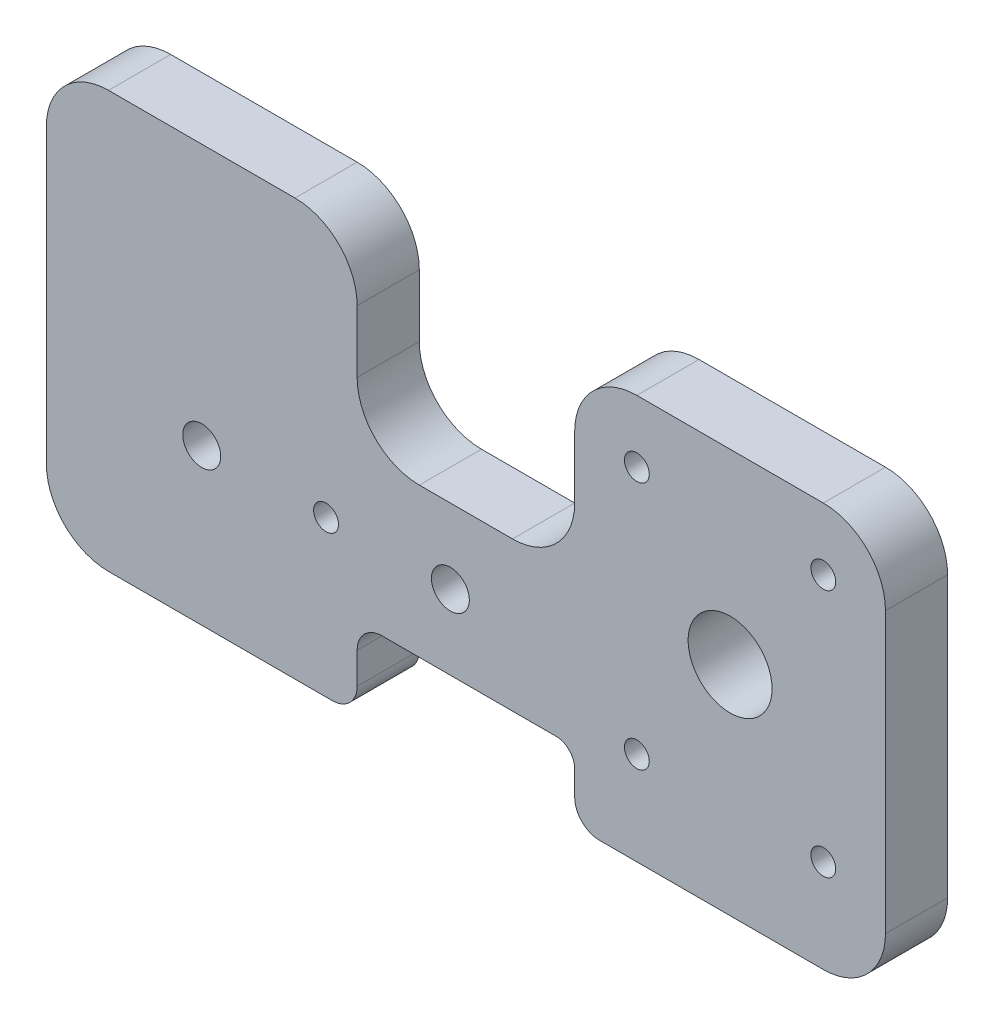
ISO-10303-21;
HEADER;
FILE_DESCRIPTION(('STEP AP214'),'2;1');
FILE_NAME('part.step','',(''),(''),'','','');
FILE_SCHEMA(('AUTOMOTIVE_DESIGN { 1 0 10303 214 1 1 1 1 }'));
ENDSEC;
DATA;
#1=APPLICATION_CONTEXT('core data for automotive mechanical design processes');
#2=APPLICATION_PROTOCOL_DEFINITION('international standard','automotive_design',2000,#1);
#3=PRODUCT_CONTEXT('',#1,'mechanical');
#4=PRODUCT('Part','Part','',(#3));
#5=PRODUCT_RELATED_PRODUCT_CATEGORY('part','',(#4));
#6=PRODUCT_DEFINITION_FORMATION('','',#4);
#7=PRODUCT_DEFINITION_CONTEXT('part definition',#1,'design');
#8=PRODUCT_DEFINITION('design','',#6,#7);
#9=PRODUCT_DEFINITION_SHAPE('','',#8);
#10=(LENGTH_UNIT() NAMED_UNIT(*) SI_UNIT(.MILLI.,.METRE.));
#11=(NAMED_UNIT(*) PLANE_ANGLE_UNIT() SI_UNIT($,.RADIAN.));
#12=(NAMED_UNIT(*) SI_UNIT($,.STERADIAN.) SOLID_ANGLE_UNIT());
#13=UNCERTAINTY_MEASURE_WITH_UNIT(LENGTH_MEASURE(1.E-05),#10,'distance_accuracy_value','');
#14=(GEOMETRIC_REPRESENTATION_CONTEXT(3) GLOBAL_UNCERTAINTY_ASSIGNED_CONTEXT((#13)) GLOBAL_UNIT_ASSIGNED_CONTEXT((#10,
#11,#12)) REPRESENTATION_CONTEXT('',''));
#15=CARTESIAN_POINT('',(0.,0.,0.));
#16=DIRECTION('',(0.,0.,1.));
#17=DIRECTION('',(1.,0.,0.));
#18=AXIS2_PLACEMENT_3D('',#15,#16,#17);
#19=CARTESIAN_POINT('',(110.9105691057,-0.999999999999983,10.));
#20=DIRECTION('',(0.,0.,1.));
#21=DIRECTION('',(1.,0.,0.));
#22=AXIS2_PLACEMENT_3D('',#19,#20,#21);
#23=PLANE('',#22);
#24=CARTESIAN_POINT('',(131.9105691057,30.,10.));
#25=DIRECTION('',(0.,0.,1.));
#26=DIRECTION('',(1.,0.,0.));
#27=AXIS2_PLACEMENT_3D('',#24,#25,#26);
#28=CIRCLE('',#27,6.75000000000001);
#29=CARTESIAN_POINT('',(138.6605691057,30.,10.));
#30=VERTEX_POINT('',#29);
#31=EDGE_CURVE('E465',#30,#30,#28,.T.);
#32=ORIENTED_EDGE('',*,*,#31,.F.);
#33=EDGE_LOOP('',(#32));
#34=FACE_BOUND('',#33,.T.);
#35=CARTESIAN_POINT('',(146.9105691057,50.,10.));
#36=DIRECTION('',(0.,0.,1.));
#37=DIRECTION('',(1.,0.,0.));
#38=AXIS2_PLACEMENT_3D('',#35,#36,#37);
#39=CIRCLE('',#38,1.99999999999997);
#40=CARTESIAN_POINT('',(148.9105691057,50.,10.));
#41=VERTEX_POINT('',#40);
#42=EDGE_CURVE('E477',#41,#41,#39,.T.);
#43=ORIENTED_EDGE('',*,*,#42,.F.);
#44=EDGE_LOOP('',(#43));
#45=FACE_BOUND('',#44,.T.);
#46=CARTESIAN_POINT('',(116.9105691057,10.,10.));
#47=DIRECTION('',(0.,0.,1.));
#48=DIRECTION('',(1.,0.,0.));
#49=AXIS2_PLACEMENT_3D('',#46,#47,#48);
#50=CIRCLE('',#49,2.00000000000002);
#51=CARTESIAN_POINT('',(118.9105691057,10.,10.));
#52=VERTEX_POINT('',#51);
#53=EDGE_CURVE('E489',#52,#52,#50,.T.);
#54=ORIENTED_EDGE('',*,*,#53,.F.);
#55=EDGE_LOOP('',(#54));
#56=FACE_BOUND('',#55,.T.);
#57=CARTESIAN_POINT('',(66.9105691057,18.,10.));
#58=DIRECTION('',(0.,0.,1.));
#59=DIRECTION('',(1.,0.,0.));
#60=AXIS2_PLACEMENT_3D('',#57,#58,#59);
#61=CIRCLE('',#60,1.99999999999999);
#62=CARTESIAN_POINT('',(68.9105691057,18.,10.));
#63=VERTEX_POINT('',#62);
#64=EDGE_CURVE('E232',#63,#63,#61,.T.);
#65=ORIENTED_EDGE('',*,*,#64,.F.);
#66=EDGE_LOOP('',(#65));
#67=FACE_BOUND('',#66,.T.);
#68=CARTESIAN_POINT('',(110.9105691057,-0.999999999999983,10.));
#69=DIRECTION('',(0.,0.,1.));
#70=DIRECTION('',(1.,0.,0.));
#71=AXIS2_PLACEMENT_3D('',#68,#69,#70);
#72=CIRCLE('',#71,4.00000000000002);
#73=CARTESIAN_POINT('',(106.9105691057,-1.,10.));
#74=VERTEX_POINT('',#73);
#75=CARTESIAN_POINT('',(110.9105691057,-5.,10.));
#76=VERTEX_POINT('',#75);
#77=EDGE_CURVE('E275',#74,#76,#72,.T.);
#78=ORIENTED_EDGE('',*,*,#77,.T.);
#79=DIRECTION('',(1.,0.,0.));
#80=VECTOR('',#79,1.);
#81=CARTESIAN_POINT('',(146.9105691057,-5.,10.));
#82=LINE('',#81,#80);
#83=CARTESIAN_POINT('',(146.9105691057,-5.,10.));
#84=VERTEX_POINT('',#83);
#85=EDGE_CURVE('E143',#76,#84,#82,.T.);
#86=ORIENTED_EDGE('',*,*,#85,.T.);
#87=CARTESIAN_POINT('',(146.9105691057,5.00000000000001,10.));
#88=DIRECTION('',(0.,0.,1.));
#89=DIRECTION('',(1.,0.,0.));
#90=AXIS2_PLACEMENT_3D('',#87,#88,#89);
#91=CIRCLE('',#90,10.);
#92=CARTESIAN_POINT('',(156.9105691057,5.,10.));
#93=VERTEX_POINT('',#92);
#94=EDGE_CURVE('E338',#84,#93,#91,.T.);
#95=ORIENTED_EDGE('',*,*,#94,.T.);
#96=DIRECTION('',(0.,1.,0.));
#97=VECTOR('',#96,1.);
#98=CARTESIAN_POINT('',(156.9105691057,5.,10.));
#99=LINE('',#98,#97);
#100=CARTESIAN_POINT('',(156.9105691057,50.,10.));
#101=VERTEX_POINT('',#100);
#102=EDGE_CURVE('E357',#93,#101,#99,.T.);
#103=ORIENTED_EDGE('',*,*,#102,.T.);
#104=CARTESIAN_POINT('',(146.9105691057,50.,10.));
#105=DIRECTION('',(0.,0.,1.));
#106=DIRECTION('',(1.,0.,0.));
#107=AXIS2_PLACEMENT_3D('',#104,#105,#106);
#108=CIRCLE('',#107,10.);
#109=CARTESIAN_POINT('',(146.9105691057,60.,10.));
#110=VERTEX_POINT('',#109);
#111=EDGE_CURVE('E354',#101,#110,#108,.T.);
#112=ORIENTED_EDGE('',*,*,#111,.T.);
#113=DIRECTION('',(-1.,0.,0.));
#114=VECTOR('',#113,1.);
#115=CARTESIAN_POINT('',(146.9105691057,60.,10.));
#116=LINE('',#115,#114);
#117=CARTESIAN_POINT('',(116.9105691057,60.,10.));
#118=VERTEX_POINT('',#117);
#119=EDGE_CURVE('E356',#110,#118,#116,.T.);
#120=ORIENTED_EDGE('',*,*,#119,.T.);
#121=CARTESIAN_POINT('',(116.9105691057,50.,10.));
#122=DIRECTION('',(0.,0.,1.));
#123=DIRECTION('',(1.,0.,0.));
#124=AXIS2_PLACEMENT_3D('',#121,#122,#123);
#125=CIRCLE('',#124,10.);
#126=CARTESIAN_POINT('',(106.9105691057,50.,10.));
#127=VERTEX_POINT('',#126);
#128=EDGE_CURVE('E359',#118,#127,#125,.T.);
#129=ORIENTED_EDGE('',*,*,#128,.T.);
#130=DIRECTION('',(0.,-1.,0.));
#131=VECTOR('',#130,1.);
#132=CARTESIAN_POINT('',(106.9105691057,50.,10.));
#133=LINE('',#132,#131);
#134=CARTESIAN_POINT('',(106.9105691057,40.0000000000001,10.));
#135=VERTEX_POINT('',#134);
#136=EDGE_CURVE('E365',#127,#135,#133,.T.);
#137=ORIENTED_EDGE('',*,*,#136,.T.);
#138=CARTESIAN_POINT('',(96.9105691056999,40.0000000000001,10.));
#139=DIRECTION('',(0.,0.,-1.));
#140=DIRECTION('',(1.,0.,0.));
#141=AXIS2_PLACEMENT_3D('',#138,#139,#140);
#142=CIRCLE('',#141,10.0000000000001);
#143=CARTESIAN_POINT('',(96.9105691057,30.,10.));
#144=VERTEX_POINT('',#143);
#145=EDGE_CURVE('E367',#135,#144,#142,.T.);
#146=ORIENTED_EDGE('',*,*,#145,.T.);
#147=DIRECTION('',(-1.,0.,0.));
#148=VECTOR('',#147,1.);
#149=CARTESIAN_POINT('',(96.9105691057,30.,10.));
#150=LINE('',#149,#148);
#151=CARTESIAN_POINT('',(81.9105691057,30.,10.));
#152=VERTEX_POINT('',#151);
#153=EDGE_CURVE('E369',#144,#152,#150,.T.);
#154=ORIENTED_EDGE('',*,*,#153,.T.);
#155=CARTESIAN_POINT('',(81.9105691057,40.,10.));
#156=DIRECTION('',(0.,0.,-1.));
#157=DIRECTION('',(1.,0.,0.));
#158=AXIS2_PLACEMENT_3D('',#155,#156,#157);
#159=CIRCLE('',#158,10.);
#160=CARTESIAN_POINT('',(71.9105691057,40.,10.));
#161=VERTEX_POINT('',#160);
#162=EDGE_CURVE('E371',#152,#161,#159,.T.);
#163=ORIENTED_EDGE('',*,*,#162,.T.);
#164=DIRECTION('',(0.,1.,0.));
#165=VECTOR('',#164,1.);
#166=CARTESIAN_POINT('',(71.9105691057,50.,10.));
#167=LINE('',#166,#165);
#168=CARTESIAN_POINT('',(71.9105691057,50.,10.));
#169=VERTEX_POINT('',#168);
#170=EDGE_CURVE('E373',#161,#169,#167,.T.);
#171=ORIENTED_EDGE('',*,*,#170,.T.);
#172=CARTESIAN_POINT('',(61.9105691057,50.,10.));
#173=DIRECTION('',(0.,0.,1.));
#174=DIRECTION('',(1.,0.,0.));
#175=AXIS2_PLACEMENT_3D('',#172,#173,#174);
#176=CIRCLE('',#175,10.);
#177=CARTESIAN_POINT('',(61.9105691057,60.,10.));
#178=VERTEX_POINT('',#177);
#179=EDGE_CURVE('E375',#169,#178,#176,.T.);
#180=ORIENTED_EDGE('',*,*,#179,.T.);
#181=DIRECTION('',(-1.,0.,0.));
#182=VECTOR('',#181,1.);
#183=CARTESIAN_POINT('',(31.9105691057,60.,10.));
#184=LINE('',#183,#182);
#185=CARTESIAN_POINT('',(31.9105691057,60.,10.));
#186=VERTEX_POINT('',#185);
#187=EDGE_CURVE('E377',#178,#186,#184,.T.);
#188=ORIENTED_EDGE('',*,*,#187,.T.);
#189=CARTESIAN_POINT('',(31.9105691057,50.,10.));
#190=DIRECTION('',(0.,0.,1.));
#191=DIRECTION('',(1.,0.,0.));
#192=AXIS2_PLACEMENT_3D('',#189,#190,#191);
#193=CIRCLE('',#192,10.);
#194=CARTESIAN_POINT('',(21.9105691057,50.,10.));
#195=VERTEX_POINT('',#194);
#196=EDGE_CURVE('E379',#186,#195,#193,.T.);
#197=ORIENTED_EDGE('',*,*,#196,.T.);
#198=DIRECTION('',(0.,-1.,0.));
#199=VECTOR('',#198,1.);
#200=CARTESIAN_POINT('',(21.9105691057,2.9650844795,10.));
#201=LINE('',#200,#199);
#202=CARTESIAN_POINT('',(21.9105691057,2.9650844795,10.));
#203=VERTEX_POINT('',#202);
#204=EDGE_CURVE('E381',#195,#203,#201,.T.);
#205=ORIENTED_EDGE('',*,*,#204,.T.);
#206=CARTESIAN_POINT('',(31.9105691057,2.96508447950001,10.));
#207=DIRECTION('',(0.,0.,1.));
#208=DIRECTION('',(1.,0.,0.));
#209=AXIS2_PLACEMENT_3D('',#206,#207,#208);
#210=CIRCLE('',#209,10.);
#211=CARTESIAN_POINT('',(31.9105691057,-7.0349155205,10.));
#212=VERTEX_POINT('',#211);
#213=EDGE_CURVE('E383',#203,#212,#210,.T.);
#214=ORIENTED_EDGE('',*,*,#213,.T.);
#215=DIRECTION('',(1.,0.,0.));
#216=VECTOR('',#215,1.);
#217=CARTESIAN_POINT('',(67.9105691057,-7.0349155205,10.));
#218=LINE('',#217,#216);
#219=CARTESIAN_POINT('',(67.9105691057,-7.0349155205,10.));
#220=VERTEX_POINT('',#219);
#221=EDGE_CURVE('E385',#212,#220,#218,.T.);
#222=ORIENTED_EDGE('',*,*,#221,.T.);
#223=CARTESIAN_POINT('',(67.9105691057,-3.0349155205,10.));
#224=DIRECTION('',(0.,0.,1.));
#225=DIRECTION('',(1.,0.,0.));
#226=AXIS2_PLACEMENT_3D('',#223,#224,#225);
#227=CIRCLE('',#226,4.);
#228=CARTESIAN_POINT('',(71.9105691057,-3.0349155205,10.));
#229=VERTEX_POINT('',#228);
#230=EDGE_CURVE('E387',#220,#229,#227,.T.);
#231=ORIENTED_EDGE('',*,*,#230,.T.);
#232=DIRECTION('',(0.,1.,0.));
#233=VECTOR('',#232,1.);
#234=CARTESIAN_POINT('',(71.9105691057,2.,10.));
#235=LINE('',#234,#233);
#236=CARTESIAN_POINT('',(71.9105691057,2.,10.));
#237=VERTEX_POINT('',#236);
#238=EDGE_CURVE('E389',#229,#237,#235,.T.);
#239=ORIENTED_EDGE('',*,*,#238,.T.);
#240=CARTESIAN_POINT('',(75.9105691057,2.,10.));
#241=DIRECTION('',(0.,0.,-1.));
#242=DIRECTION('',(1.,0.,0.));
#243=AXIS2_PLACEMENT_3D('',#240,#241,#242);
#244=CIRCLE('',#243,4.00000000000001);
#245=CARTESIAN_POINT('',(75.9105691057,6.,10.));
#246=VERTEX_POINT('',#245);
#247=EDGE_CURVE('E210',#237,#246,#244,.T.);
#248=ORIENTED_EDGE('',*,*,#247,.T.);
#249=DIRECTION('',(1.,0.,0.));
#250=VECTOR('',#249,1.);
#251=CARTESIAN_POINT('',(75.9105691057,6.,10.));
#252=LINE('',#251,#250);
#253=CARTESIAN_POINT('',(103.9105691057,5.99999999999999,10.));
#254=VERTEX_POINT('',#253);
#255=EDGE_CURVE('E204',#246,#254,#252,.T.);
#256=ORIENTED_EDGE('',*,*,#255,.T.);
#257=CARTESIAN_POINT('',(103.9105691057,2.99999999999994,10.));
#258=DIRECTION('',(0.,0.,-1.));
#259=DIRECTION('',(1.,0.,0.));
#260=AXIS2_PLACEMENT_3D('',#257,#258,#259);
#261=CIRCLE('',#260,3.00000000000005);
#262=CARTESIAN_POINT('',(106.9105691057,3.,10.));
#263=VERTEX_POINT('',#262);
#264=EDGE_CURVE('E208',#254,#263,#261,.T.);
#265=ORIENTED_EDGE('',*,*,#264,.T.);
#266=DIRECTION('',(0.,-1.,0.));
#267=VECTOR('',#266,1.);
#268=CARTESIAN_POINT('',(106.9105691057,-1.,10.));
#269=LINE('',#268,#267);
#270=EDGE_CURVE('E52',#263,#74,#269,.T.);
#271=ORIENTED_EDGE('',*,*,#270,.T.);
#272=EDGE_LOOP('',(#78,#86,#95,#103,#112,#120,#129,#137,#146,#154,#163,#171,#180,#188,#197,#205,
#214,#222,#231,#239,#248,#256,#265,#271));
#273=FACE_BOUND('',#272,.T.);
#274=CARTESIAN_POINT('',(46.9105691057,18.,10.));
#275=DIRECTION('',(0.,0.,1.));
#276=DIRECTION('',(1.,0.,0.));
#277=AXIS2_PLACEMENT_3D('',#274,#275,#276);
#278=CIRCLE('',#277,3.05);
#279=CARTESIAN_POINT('',(49.9605691057,18.,10.));
#280=VERTEX_POINT('',#279);
#281=EDGE_CURVE('E495',#280,#280,#278,.T.);
#282=ORIENTED_EDGE('',*,*,#281,.F.);
#283=EDGE_LOOP('',(#282));
#284=FACE_BOUND('',#283,.T.);
#285=CARTESIAN_POINT('',(146.9105691057,10.,10.));
#286=DIRECTION('',(0.,0.,1.));
#287=DIRECTION('',(1.,0.,0.));
#288=AXIS2_PLACEMENT_3D('',#285,#286,#287);
#289=CIRCLE('',#288,1.99999999999997);
#290=CARTESIAN_POINT('',(148.9105691057,10.,10.));
#291=VERTEX_POINT('',#290);
#292=EDGE_CURVE('E483',#291,#291,#289,.T.);
#293=ORIENTED_EDGE('',*,*,#292,.F.);
#294=EDGE_LOOP('',(#293));
#295=FACE_BOUND('',#294,.T.);
#296=CARTESIAN_POINT('',(116.9105691057,50.,10.));
#297=DIRECTION('',(0.,0.,1.));
#298=DIRECTION('',(1.,0.,0.));
#299=AXIS2_PLACEMENT_3D('',#296,#297,#298);
#300=CIRCLE('',#299,2.00000000000002);
#301=CARTESIAN_POINT('',(118.9105691057,50.,10.));
#302=VERTEX_POINT('',#301);
#303=EDGE_CURVE('E471',#302,#302,#300,.T.);
#304=ORIENTED_EDGE('',*,*,#303,.F.);
#305=EDGE_LOOP('',(#304));
#306=FACE_BOUND('',#305,.T.);
#307=CARTESIAN_POINT('',(86.9105691057,18.,10.));
#308=DIRECTION('',(0.,0.,1.));
#309=DIRECTION('',(1.,0.,0.));
#310=AXIS2_PLACEMENT_3D('',#307,#308,#309);
#311=CIRCLE('',#310,3.05);
#312=CARTESIAN_POINT('',(89.9605691057,18.,10.));
#313=VERTEX_POINT('',#312);
#314=EDGE_CURVE('E456',#313,#313,#311,.T.);
#315=ORIENTED_EDGE('',*,*,#314,.F.);
#316=EDGE_LOOP('',(#315));
#317=FACE_BOUND('',#316,.T.);
#318=ADVANCED_FACE('F35',(#34,#45,#56,#67,#273,#284,#295,#306,#317),#23,.T.);
#319=CARTESIAN_POINT('',(110.9105691057,-0.999999999999983,0.));
#320=DIRECTION('',(0.,0.,1.));
#321=DIRECTION('',(1.,0.,0.));
#322=AXIS2_PLACEMENT_3D('',#319,#320,#321);
#323=PLANE('',#322);
#324=CARTESIAN_POINT('',(110.9105691057,-0.999999999999983,0.));
#325=DIRECTION('',(0.,0.,1.));
#326=DIRECTION('',(1.,0.,0.));
#327=AXIS2_PLACEMENT_3D('',#324,#325,#326);
#328=CIRCLE('',#327,4.00000000000002);
#329=CARTESIAN_POINT('',(106.9105691057,-1.,0.));
#330=VERTEX_POINT('',#329);
#331=CARTESIAN_POINT('',(110.9105691057,-5.,0.));
#332=VERTEX_POINT('',#331);
#333=EDGE_CURVE('E228',#330,#332,#328,.T.);
#334=ORIENTED_EDGE('',*,*,#333,.F.);
#335=DIRECTION('',(0.,-1.,0.));
#336=VECTOR('',#335,1.);
#337=CARTESIAN_POINT('',(106.9105691057,-1.,0.));
#338=LINE('',#337,#336);
#339=CARTESIAN_POINT('',(106.9105691057,3.,0.));
#340=VERTEX_POINT('',#339);
#341=EDGE_CURVE('E135',#340,#330,#338,.T.);
#342=ORIENTED_EDGE('',*,*,#341,.F.);
#343=CARTESIAN_POINT('',(103.9105691057,2.99999999999994,0.));
#344=DIRECTION('',(0.,0.,-1.));
#345=DIRECTION('',(1.,0.,0.));
#346=AXIS2_PLACEMENT_3D('',#343,#344,#345);
#347=CIRCLE('',#346,3.00000000000005);
#348=CARTESIAN_POINT('',(103.9105691057,5.99999999999999,0.));
#349=VERTEX_POINT('',#348);
#350=EDGE_CURVE('E129',#349,#340,#347,.T.);
#351=ORIENTED_EDGE('',*,*,#350,.F.);
#352=DIRECTION('',(1.,0.,0.));
#353=VECTOR('',#352,1.);
#354=CARTESIAN_POINT('',(75.9105691057,6.,0.));
#355=LINE('',#354,#353);
#356=CARTESIAN_POINT('',(75.9105691057,6.,0.));
#357=VERTEX_POINT('',#356);
#358=EDGE_CURVE('E218',#357,#349,#355,.T.);
#359=ORIENTED_EDGE('',*,*,#358,.F.);
#360=CARTESIAN_POINT('',(75.9105691057,2.,0.));
#361=DIRECTION('',(0.,0.,-1.));
#362=DIRECTION('',(1.,0.,0.));
#363=AXIS2_PLACEMENT_3D('',#360,#361,#362);
#364=CIRCLE('',#363,4.00000000000001);
#365=CARTESIAN_POINT('',(71.9105691057,2.,0.));
#366=VERTEX_POINT('',#365);
#367=EDGE_CURVE('E270',#366,#357,#364,.T.);
#368=ORIENTED_EDGE('',*,*,#367,.F.);
#369=DIRECTION('',(0.,1.,0.));
#370=VECTOR('',#369,1.);
#371=CARTESIAN_POINT('',(71.9105691057,2.,0.));
#372=LINE('',#371,#370);
#373=CARTESIAN_POINT('',(71.9105691057,-3.0349155205,0.));
#374=VERTEX_POINT('',#373);
#375=EDGE_CURVE('E268',#374,#366,#372,.T.);
#376=ORIENTED_EDGE('',*,*,#375,.F.);
#377=CARTESIAN_POINT('',(67.9105691057,-3.0349155205,0.));
#378=DIRECTION('',(0.,0.,1.));
#379=DIRECTION('',(1.,0.,0.));
#380=AXIS2_PLACEMENT_3D('',#377,#378,#379);
#381=CIRCLE('',#380,4.);
#382=CARTESIAN_POINT('',(67.9105691057,-7.0349155205,0.));
#383=VERTEX_POINT('',#382);
#384=EDGE_CURVE('E266',#383,#374,#381,.T.);
#385=ORIENTED_EDGE('',*,*,#384,.F.);
#386=DIRECTION('',(1.,0.,0.));
#387=VECTOR('',#386,1.);
#388=CARTESIAN_POINT('',(67.9105691057,-7.0349155205,0.));
#389=LINE('',#388,#387);
#390=CARTESIAN_POINT('',(31.9105691057,-7.0349155205,0.));
#391=VERTEX_POINT('',#390);
#392=EDGE_CURVE('E264',#391,#383,#389,.T.);
#393=ORIENTED_EDGE('',*,*,#392,.F.);
#394=CARTESIAN_POINT('',(31.9105691057,2.96508447950001,0.));
#395=DIRECTION('',(0.,0.,1.));
#396=DIRECTION('',(1.,0.,0.));
#397=AXIS2_PLACEMENT_3D('',#394,#395,#396);
#398=CIRCLE('',#397,10.);
#399=CARTESIAN_POINT('',(21.9105691057,2.9650844795,0.));
#400=VERTEX_POINT('',#399);
#401=EDGE_CURVE('E262',#400,#391,#398,.T.);
#402=ORIENTED_EDGE('',*,*,#401,.F.);
#403=DIRECTION('',(0.,-1.,0.));
#404=VECTOR('',#403,1.);
#405=CARTESIAN_POINT('',(21.9105691057,2.9650844795,0.));
#406=LINE('',#405,#404);
#407=CARTESIAN_POINT('',(21.9105691057,50.,0.));
#408=VERTEX_POINT('',#407);
#409=EDGE_CURVE('E260',#408,#400,#406,.T.);
#410=ORIENTED_EDGE('',*,*,#409,.F.);
#411=CARTESIAN_POINT('',(31.9105691057,50.,0.));
#412=DIRECTION('',(0.,0.,1.));
#413=DIRECTION('',(1.,0.,0.));
#414=AXIS2_PLACEMENT_3D('',#411,#412,#413);
#415=CIRCLE('',#414,10.);
#416=CARTESIAN_POINT('',(31.9105691057,60.,0.));
#417=VERTEX_POINT('',#416);
#418=EDGE_CURVE('E258',#417,#408,#415,.T.);
#419=ORIENTED_EDGE('',*,*,#418,.F.);
#420=DIRECTION('',(-1.,0.,0.));
#421=VECTOR('',#420,1.);
#422=CARTESIAN_POINT('',(31.9105691057,60.,0.));
#423=LINE('',#422,#421);
#424=CARTESIAN_POINT('',(61.9105691057,60.,0.));
#425=VERTEX_POINT('',#424);
#426=EDGE_CURVE('E256',#425,#417,#423,.T.);
#427=ORIENTED_EDGE('',*,*,#426,.F.);
#428=CARTESIAN_POINT('',(61.9105691057,50.,0.));
#429=DIRECTION('',(0.,0.,1.));
#430=DIRECTION('',(1.,0.,0.));
#431=AXIS2_PLACEMENT_3D('',#428,#429,#430);
#432=CIRCLE('',#431,10.);
#433=CARTESIAN_POINT('',(71.9105691057,50.,0.));
#434=VERTEX_POINT('',#433);
#435=EDGE_CURVE('E254',#434,#425,#432,.T.);
#436=ORIENTED_EDGE('',*,*,#435,.F.);
#437=DIRECTION('',(0.,1.,0.));
#438=VECTOR('',#437,1.);
#439=CARTESIAN_POINT('',(71.9105691057,50.,0.));
#440=LINE('',#439,#438);
#441=CARTESIAN_POINT('',(71.9105691057,40.,0.));
#442=VERTEX_POINT('',#441);
#443=EDGE_CURVE('E252',#442,#434,#440,.T.);
#444=ORIENTED_EDGE('',*,*,#443,.F.);
#445=CARTESIAN_POINT('',(81.9105691057,40.,0.));
#446=DIRECTION('',(0.,0.,-1.));
#447=DIRECTION('',(1.,0.,0.));
#448=AXIS2_PLACEMENT_3D('',#445,#446,#447);
#449=CIRCLE('',#448,10.);
#450=CARTESIAN_POINT('',(81.9105691057,30.,0.));
#451=VERTEX_POINT('',#450);
#452=EDGE_CURVE('E250',#451,#442,#449,.T.);
#453=ORIENTED_EDGE('',*,*,#452,.F.);
#454=DIRECTION('',(-1.,0.,0.));
#455=VECTOR('',#454,1.);
#456=CARTESIAN_POINT('',(96.9105691057,30.,0.));
#457=LINE('',#456,#455);
#458=CARTESIAN_POINT('',(96.9105691057,30.,0.));
#459=VERTEX_POINT('',#458);
#460=EDGE_CURVE('E248',#459,#451,#457,.T.);
#461=ORIENTED_EDGE('',*,*,#460,.F.);
#462=CARTESIAN_POINT('',(96.9105691056999,40.0000000000001,0.));
#463=DIRECTION('',(0.,0.,-1.));
#464=DIRECTION('',(1.,0.,0.));
#465=AXIS2_PLACEMENT_3D('',#462,#463,#464);
#466=CIRCLE('',#465,10.0000000000001);
#467=CARTESIAN_POINT('',(106.9105691057,40.0000000000001,0.));
#468=VERTEX_POINT('',#467);
#469=EDGE_CURVE('E246',#468,#459,#466,.T.);
#470=ORIENTED_EDGE('',*,*,#469,.F.);
#471=DIRECTION('',(0.,-1.,0.));
#472=VECTOR('',#471,1.);
#473=CARTESIAN_POINT('',(106.9105691057,50.,0.));
#474=LINE('',#473,#472);
#475=CARTESIAN_POINT('',(106.9105691057,50.,0.));
#476=VERTEX_POINT('',#475);
#477=EDGE_CURVE('E244',#476,#468,#474,.T.);
#478=ORIENTED_EDGE('',*,*,#477,.F.);
#479=CARTESIAN_POINT('',(116.9105691057,50.,0.));
#480=DIRECTION('',(0.,0.,1.));
#481=DIRECTION('',(1.,0.,0.));
#482=AXIS2_PLACEMENT_3D('',#479,#480,#481);
#483=CIRCLE('',#482,10.);
#484=CARTESIAN_POINT('',(116.9105691057,60.,0.));
#485=VERTEX_POINT('',#484);
#486=EDGE_CURVE('E242',#485,#476,#483,.T.);
#487=ORIENTED_EDGE('',*,*,#486,.F.);
#488=DIRECTION('',(-1.,0.,0.));
#489=VECTOR('',#488,1.);
#490=CARTESIAN_POINT('',(146.9105691057,60.,0.));
#491=LINE('',#490,#489);
#492=CARTESIAN_POINT('',(146.9105691057,60.,0.));
#493=VERTEX_POINT('',#492);
#494=EDGE_CURVE('E240',#493,#485,#491,.T.);
#495=ORIENTED_EDGE('',*,*,#494,.F.);
#496=CARTESIAN_POINT('',(146.9105691057,50.,0.));
#497=DIRECTION('',(0.,0.,1.));
#498=DIRECTION('',(1.,0.,0.));
#499=AXIS2_PLACEMENT_3D('',#496,#497,#498);
#500=CIRCLE('',#499,10.);
#501=CARTESIAN_POINT('',(156.9105691057,50.,0.));
#502=VERTEX_POINT('',#501);
#503=EDGE_CURVE('E238',#502,#493,#500,.T.);
#504=ORIENTED_EDGE('',*,*,#503,.F.);
#505=DIRECTION('',(0.,1.,0.));
#506=VECTOR('',#505,1.);
#507=CARTESIAN_POINT('',(156.9105691057,5.,0.));
#508=LINE('',#507,#506);
#509=CARTESIAN_POINT('',(156.9105691057,5.,0.));
#510=VERTEX_POINT('',#509);
#511=EDGE_CURVE('E236',#510,#502,#508,.T.);
#512=ORIENTED_EDGE('',*,*,#511,.F.);
#513=CARTESIAN_POINT('',(146.9105691057,5.00000000000001,0.));
#514=DIRECTION('',(0.,0.,1.));
#515=DIRECTION('',(1.,0.,0.));
#516=AXIS2_PLACEMENT_3D('',#513,#514,#515);
#517=CIRCLE('',#516,10.);
#518=CARTESIAN_POINT('',(146.9105691057,-5.,0.));
#519=VERTEX_POINT('',#518);
#520=EDGE_CURVE('E234',#519,#510,#517,.T.);
#521=ORIENTED_EDGE('',*,*,#520,.F.);
#522=DIRECTION('',(1.,0.,0.));
#523=VECTOR('',#522,1.);
#524=CARTESIAN_POINT('',(146.9105691057,-5.,0.));
#525=LINE('',#524,#523);
#526=EDGE_CURVE('E231',#332,#519,#525,.T.);
#527=ORIENTED_EDGE('',*,*,#526,.F.);
#528=EDGE_LOOP('',(#334,#342,#351,#359,#368,#376,#385,#393,#402,#410,#419,#427,#436,#444,#453,
#461,#470,#478,#487,#495,#504,#512,#521,#527));
#529=FACE_BOUND('',#528,.T.);
#530=CARTESIAN_POINT('',(66.9105691057,18.,0.));
#531=DIRECTION('',(0.,0.,1.));
#532=DIRECTION('',(1.,0.,0.));
#533=AXIS2_PLACEMENT_3D('',#530,#531,#532);
#534=CIRCLE('',#533,1.99999999999999);
#535=CARTESIAN_POINT('',(68.9105691057,18.,0.));
#536=VERTEX_POINT('',#535);
#537=EDGE_CURVE('E498',#536,#536,#534,.T.);
#538=ORIENTED_EDGE('',*,*,#537,.T.);
#539=EDGE_LOOP('',(#538));
#540=FACE_BOUND('',#539,.T.);
#541=CARTESIAN_POINT('',(46.9105691057,18.,0.));
#542=DIRECTION('',(0.,0.,1.));
#543=DIRECTION('',(1.,0.,0.));
#544=AXIS2_PLACEMENT_3D('',#541,#542,#543);
#545=CIRCLE('',#544,3.05);
#546=CARTESIAN_POINT('',(49.9605691057,18.,0.));
#547=VERTEX_POINT('',#546);
#548=EDGE_CURVE('E492',#547,#547,#545,.T.);
#549=ORIENTED_EDGE('',*,*,#548,.T.);
#550=EDGE_LOOP('',(#549));
#551=FACE_BOUND('',#550,.T.);
#552=CARTESIAN_POINT('',(116.9105691057,10.,0.));
#553=DIRECTION('',(0.,0.,1.));
#554=DIRECTION('',(1.,0.,0.));
#555=AXIS2_PLACEMENT_3D('',#552,#553,#554);
#556=CIRCLE('',#555,2.00000000000002);
#557=CARTESIAN_POINT('',(118.9105691057,10.,0.));
#558=VERTEX_POINT('',#557);
#559=EDGE_CURVE('E486',#558,#558,#556,.T.);
#560=ORIENTED_EDGE('',*,*,#559,.T.);
#561=EDGE_LOOP('',(#560));
#562=FACE_BOUND('',#561,.T.);
#563=CARTESIAN_POINT('',(146.9105691057,10.,0.));
#564=DIRECTION('',(0.,0.,1.));
#565=DIRECTION('',(1.,0.,0.));
#566=AXIS2_PLACEMENT_3D('',#563,#564,#565);
#567=CIRCLE('',#566,1.99999999999997);
#568=CARTESIAN_POINT('',(148.9105691057,10.,0.));
#569=VERTEX_POINT('',#568);
#570=EDGE_CURVE('E480',#569,#569,#567,.T.);
#571=ORIENTED_EDGE('',*,*,#570,.T.);
#572=EDGE_LOOP('',(#571));
#573=FACE_BOUND('',#572,.T.);
#574=CARTESIAN_POINT('',(146.9105691057,50.,0.));
#575=DIRECTION('',(0.,0.,1.));
#576=DIRECTION('',(1.,0.,0.));
#577=AXIS2_PLACEMENT_3D('',#574,#575,#576);
#578=CIRCLE('',#577,1.99999999999997);
#579=CARTESIAN_POINT('',(148.9105691057,50.,0.));
#580=VERTEX_POINT('',#579);
#581=EDGE_CURVE('E474',#580,#580,#578,.T.);
#582=ORIENTED_EDGE('',*,*,#581,.T.);
#583=EDGE_LOOP('',(#582));
#584=FACE_BOUND('',#583,.T.);
#585=CARTESIAN_POINT('',(116.9105691057,50.,0.));
#586=DIRECTION('',(0.,0.,1.));
#587=DIRECTION('',(1.,0.,0.));
#588=AXIS2_PLACEMENT_3D('',#585,#586,#587);
#589=CIRCLE('',#588,2.00000000000002);
#590=CARTESIAN_POINT('',(118.9105691057,50.,0.));
#591=VERTEX_POINT('',#590);
#592=EDGE_CURVE('E468',#591,#591,#589,.T.);
#593=ORIENTED_EDGE('',*,*,#592,.T.);
#594=EDGE_LOOP('',(#593));
#595=FACE_BOUND('',#594,.T.);
#596=CARTESIAN_POINT('',(131.9105691057,30.,0.));
#597=DIRECTION('',(0.,0.,1.));
#598=DIRECTION('',(1.,0.,0.));
#599=AXIS2_PLACEMENT_3D('',#596,#597,#598);
#600=CIRCLE('',#599,6.75000000000001);
#601=CARTESIAN_POINT('',(138.6605691057,30.,0.));
#602=VERTEX_POINT('',#601);
#603=EDGE_CURVE('E462',#602,#602,#600,.T.);
#604=ORIENTED_EDGE('',*,*,#603,.T.);
#605=EDGE_LOOP('',(#604));
#606=FACE_BOUND('',#605,.T.);
#607=CARTESIAN_POINT('',(86.9105691057,18.,0.));
#608=DIRECTION('',(0.,0.,1.));
#609=DIRECTION('',(1.,0.,0.));
#610=AXIS2_PLACEMENT_3D('',#607,#608,#609);
#611=CIRCLE('',#610,3.05);
#612=CARTESIAN_POINT('',(89.9605691057,18.,0.));
#613=VERTEX_POINT('',#612);
#614=EDGE_CURVE('E459',#613,#613,#611,.T.);
#615=ORIENTED_EDGE('',*,*,#614,.T.);
#616=EDGE_LOOP('',(#615));
#617=FACE_BOUND('',#616,.T.);
#618=ADVANCED_FACE('F342',(#529,#540,#551,#562,#573,#584,#595,#606,#617),#323,.F.);
#619=CARTESIAN_POINT('',(110.9105691057,-0.999999999999983,10.));
#620=DIRECTION('',(0.,0.,-1.));
#621=DIRECTION('',(-1.,0.,0.));
#622=AXIS2_PLACEMENT_3D('',#619,#620,#621);
#623=CYLINDRICAL_SURFACE('',#622,4.00000000000002);
#624=ORIENTED_EDGE('',*,*,#333,.T.);
#625=DIRECTION('',(0.,0.,-1.));
#626=VECTOR('',#625,1.);
#627=CARTESIAN_POINT('',(110.9105691057,-5.,10.));
#628=LINE('',#627,#626);
#629=EDGE_CURVE('E11',#76,#332,#628,.T.);
#630=ORIENTED_EDGE('',*,*,#629,.F.);
#631=ORIENTED_EDGE('',*,*,#77,.F.);
#632=DIRECTION('',(0.,0.,-1.));
#633=VECTOR('',#632,1.);
#634=CARTESIAN_POINT('',(106.9105691057,-1.,10.));
#635=LINE('',#634,#633);
#636=EDGE_CURVE('E224',#74,#330,#635,.T.);
#637=ORIENTED_EDGE('',*,*,#636,.T.);
#638=EDGE_LOOP('',(#624,#630,#631,#637));
#639=FACE_BOUND('',#638,.T.);
#640=ADVANCED_FACE('F37',(#639),#623,.T.);
#641=CARTESIAN_POINT('',(146.9105691057,-5.,10.));
#642=DIRECTION('',(0.,1.,0.));
#643=DIRECTION('',(0.,0.,1.));
#644=AXIS2_PLACEMENT_3D('',#641,#642,#643);
#645=PLANE('',#644);
#646=ORIENTED_EDGE('',*,*,#526,.T.);
#647=DIRECTION('',(0.,0.,-1.));
#648=VECTOR('',#647,1.);
#649=CARTESIAN_POINT('',(146.9105691057,-5.,10.));
#650=LINE('',#649,#648);
#651=EDGE_CURVE('E44',#84,#519,#650,.T.);
#652=ORIENTED_EDGE('',*,*,#651,.F.);
#653=ORIENTED_EDGE('',*,*,#85,.F.);
#654=ORIENTED_EDGE('',*,*,#629,.T.);
#655=EDGE_LOOP('',(#646,#652,#653,#654));
#656=FACE_BOUND('',#655,.T.);
#657=ADVANCED_FACE('F764',(#656),#645,.F.);
#658=CARTESIAN_POINT('',(146.9105691057,5.00000000000001,10.));
#659=DIRECTION('',(0.,0.,-1.));
#660=DIRECTION('',(-1.,0.,0.));
#661=AXIS2_PLACEMENT_3D('',#658,#659,#660);
#662=CYLINDRICAL_SURFACE('',#661,10.);
#663=ORIENTED_EDGE('',*,*,#520,.T.);
#664=DIRECTION('',(0.,0.,-1.));
#665=VECTOR('',#664,1.);
#666=CARTESIAN_POINT('',(156.9105691057,5.,10.));
#667=LINE('',#666,#665);
#668=EDGE_CURVE('E330',#93,#510,#667,.T.);
#669=ORIENTED_EDGE('',*,*,#668,.F.);
#670=ORIENTED_EDGE('',*,*,#94,.F.);
#671=ORIENTED_EDGE('',*,*,#651,.T.);
#672=EDGE_LOOP('',(#663,#669,#670,#671));
#673=FACE_BOUND('',#672,.T.);
#674=ADVANCED_FACE('F336',(#673),#662,.T.);
#675=CARTESIAN_POINT('',(156.9105691057,5.,10.));
#676=DIRECTION('',(-1.,0.,0.));
#677=DIRECTION('',(0.,0.,1.));
#678=AXIS2_PLACEMENT_3D('',#675,#676,#677);
#679=PLANE('',#678);
#680=ORIENTED_EDGE('',*,*,#511,.T.);
#681=DIRECTION('',(0.,0.,-1.));
#682=VECTOR('',#681,1.);
#683=CARTESIAN_POINT('',(156.9105691057,50.,10.));
#684=LINE('',#683,#682);
#685=EDGE_CURVE('E327',#101,#502,#684,.T.);
#686=ORIENTED_EDGE('',*,*,#685,.F.);
#687=ORIENTED_EDGE('',*,*,#102,.F.);
#688=ORIENTED_EDGE('',*,*,#668,.T.);
#689=EDGE_LOOP('',(#680,#686,#687,#688));
#690=FACE_BOUND('',#689,.T.);
#691=ADVANCED_FACE('F348',(#690),#679,.F.);
#692=CARTESIAN_POINT('',(146.9105691057,50.,10.));
#693=DIRECTION('',(0.,0.,-1.));
#694=DIRECTION('',(-1.,0.,0.));
#695=AXIS2_PLACEMENT_3D('',#692,#693,#694);
#696=CYLINDRICAL_SURFACE('',#695,10.);
#697=ORIENTED_EDGE('',*,*,#503,.T.);
#698=DIRECTION('',(0.,0.,-1.));
#699=VECTOR('',#698,1.);
#700=CARTESIAN_POINT('',(146.9105691057,60.,10.));
#701=LINE('',#700,#699);
#702=EDGE_CURVE('E324',#110,#493,#701,.T.);
#703=ORIENTED_EDGE('',*,*,#702,.F.);
#704=ORIENTED_EDGE('',*,*,#111,.F.);
#705=ORIENTED_EDGE('',*,*,#685,.T.);
#706=EDGE_LOOP('',(#697,#703,#704,#705));
#707=FACE_BOUND('',#706,.T.);
#708=ADVANCED_FACE('F352',(#707),#696,.T.);
#709=CARTESIAN_POINT('',(146.9105691057,60.,10.));
#710=DIRECTION('',(0.,-1.,0.));
#711=DIRECTION('',(0.,0.,-1.));
#712=AXIS2_PLACEMENT_3D('',#709,#710,#711);
#713=PLANE('',#712);
#714=ORIENTED_EDGE('',*,*,#494,.T.);
#715=DIRECTION('',(0.,0.,-1.));
#716=VECTOR('',#715,1.);
#717=CARTESIAN_POINT('',(116.9105691057,60.,10.));
#718=LINE('',#717,#716);
#719=EDGE_CURVE('E321',#118,#485,#718,.T.);
#720=ORIENTED_EDGE('',*,*,#719,.F.);
#721=ORIENTED_EDGE('',*,*,#119,.F.);
#722=ORIENTED_EDGE('',*,*,#702,.T.);
#723=EDGE_LOOP('',(#714,#720,#721,#722));
#724=FACE_BOUND('',#723,.T.);
#725=ADVANCED_FACE('F729',(#724),#713,.F.);
#726=CARTESIAN_POINT('',(116.9105691057,50.,10.));
#727=DIRECTION('',(0.,0.,-1.));
#728=DIRECTION('',(-1.,0.,0.));
#729=AXIS2_PLACEMENT_3D('',#726,#727,#728);
#730=CYLINDRICAL_SURFACE('',#729,10.);
#731=ORIENTED_EDGE('',*,*,#486,.T.);
#732=DIRECTION('',(0.,0.,-1.));
#733=VECTOR('',#732,1.);
#734=CARTESIAN_POINT('',(106.9105691057,50.,10.));
#735=LINE('',#734,#733);
#736=EDGE_CURVE('E318',#127,#476,#735,.T.);
#737=ORIENTED_EDGE('',*,*,#736,.F.);
#738=ORIENTED_EDGE('',*,*,#128,.F.);
#739=ORIENTED_EDGE('',*,*,#719,.T.);
#740=EDGE_LOOP('',(#731,#737,#738,#739));
#741=FACE_BOUND('',#740,.T.);
#742=ADVANCED_FACE('F719',(#741),#730,.T.);
#743=CARTESIAN_POINT('',(106.9105691057,50.,10.));
#744=DIRECTION('',(1.,0.,0.));
#745=DIRECTION('',(0.,0.,-1.));
#746=AXIS2_PLACEMENT_3D('',#743,#744,#745);
#747=PLANE('',#746);
#748=ORIENTED_EDGE('',*,*,#477,.T.);
#749=DIRECTION('',(0.,0.,-1.));
#750=VECTOR('',#749,1.);
#751=CARTESIAN_POINT('',(106.9105691057,40.0000000000001,10.));
#752=LINE('',#751,#750);
#753=EDGE_CURVE('E315',#135,#468,#752,.T.);
#754=ORIENTED_EDGE('',*,*,#753,.F.);
#755=ORIENTED_EDGE('',*,*,#136,.F.);
#756=ORIENTED_EDGE('',*,*,#736,.T.);
#757=EDGE_LOOP('',(#748,#754,#755,#756));
#758=FACE_BOUND('',#757,.T.);
#759=ADVANCED_FACE('F709',(#758),#747,.F.);
#760=CARTESIAN_POINT('',(96.9105691056999,40.0000000000001,10.));
#761=DIRECTION('',(0.,0.,-1.));
#762=DIRECTION('',(-1.,0.,0.));
#763=AXIS2_PLACEMENT_3D('',#760,#761,#762);
#764=CYLINDRICAL_SURFACE('',#763,10.0000000000001);
#765=ORIENTED_EDGE('',*,*,#469,.T.);
#766=DIRECTION('',(0.,0.,-1.));
#767=VECTOR('',#766,1.);
#768=CARTESIAN_POINT('',(96.9105691057,30.,10.));
#769=LINE('',#768,#767);
#770=EDGE_CURVE('E312',#144,#459,#769,.T.);
#771=ORIENTED_EDGE('',*,*,#770,.F.);
#772=ORIENTED_EDGE('',*,*,#145,.F.);
#773=ORIENTED_EDGE('',*,*,#753,.T.);
#774=EDGE_LOOP('',(#765,#771,#772,#773));
#775=FACE_BOUND('',#774,.T.);
#776=ADVANCED_FACE('F699',(#775),#764,.F.);
#777=CARTESIAN_POINT('',(96.9105691057,30.,10.));
#778=DIRECTION('',(0.,-1.,0.));
#779=DIRECTION('',(0.,0.,-1.));
#780=AXIS2_PLACEMENT_3D('',#777,#778,#779);
#781=PLANE('',#780);
#782=ORIENTED_EDGE('',*,*,#460,.T.);
#783=DIRECTION('',(0.,0.,-1.));
#784=VECTOR('',#783,1.);
#785=CARTESIAN_POINT('',(81.9105691057,30.,10.));
#786=LINE('',#785,#784);
#787=EDGE_CURVE('E309',#152,#451,#786,.T.);
#788=ORIENTED_EDGE('',*,*,#787,.F.);
#789=ORIENTED_EDGE('',*,*,#153,.F.);
#790=ORIENTED_EDGE('',*,*,#770,.T.);
#791=EDGE_LOOP('',(#782,#788,#789,#790));
#792=FACE_BOUND('',#791,.T.);
#793=ADVANCED_FACE('F689',(#792),#781,.F.);
#794=CARTESIAN_POINT('',(81.9105691057,40.,10.));
#795=DIRECTION('',(0.,0.,-1.));
#796=DIRECTION('',(-1.,0.,0.));
#797=AXIS2_PLACEMENT_3D('',#794,#795,#796);
#798=CYLINDRICAL_SURFACE('',#797,10.);
#799=ORIENTED_EDGE('',*,*,#452,.T.);
#800=DIRECTION('',(0.,0.,-1.));
#801=VECTOR('',#800,1.);
#802=CARTESIAN_POINT('',(71.9105691057,40.,10.));
#803=LINE('',#802,#801);
#804=EDGE_CURVE('E306',#161,#442,#803,.T.);
#805=ORIENTED_EDGE('',*,*,#804,.F.);
#806=ORIENTED_EDGE('',*,*,#162,.F.);
#807=ORIENTED_EDGE('',*,*,#787,.T.);
#808=EDGE_LOOP('',(#799,#805,#806,#807));
#809=FACE_BOUND('',#808,.T.);
#810=ADVANCED_FACE('F679',(#809),#798,.F.);
#811=CARTESIAN_POINT('',(71.9105691057,50.,10.));
#812=DIRECTION('',(-1.,0.,0.));
#813=DIRECTION('',(0.,0.,1.));
#814=AXIS2_PLACEMENT_3D('',#811,#812,#813);
#815=PLANE('',#814);
#816=ORIENTED_EDGE('',*,*,#443,.T.);
#817=DIRECTION('',(0.,0.,-1.));
#818=VECTOR('',#817,1.);
#819=CARTESIAN_POINT('',(71.9105691057,50.,10.));
#820=LINE('',#819,#818);
#821=EDGE_CURVE('E303',#169,#434,#820,.T.);
#822=ORIENTED_EDGE('',*,*,#821,.F.);
#823=ORIENTED_EDGE('',*,*,#170,.F.);
#824=ORIENTED_EDGE('',*,*,#804,.T.);
#825=EDGE_LOOP('',(#816,#822,#823,#824));
#826=FACE_BOUND('',#825,.T.);
#827=ADVANCED_FACE('F669',(#826),#815,.F.);
#828=CARTESIAN_POINT('',(61.9105691057,50.,10.));
#829=DIRECTION('',(0.,0.,-1.));
#830=DIRECTION('',(-1.,0.,0.));
#831=AXIS2_PLACEMENT_3D('',#828,#829,#830);
#832=CYLINDRICAL_SURFACE('',#831,10.);
#833=ORIENTED_EDGE('',*,*,#435,.T.);
#834=DIRECTION('',(0.,0.,-1.));
#835=VECTOR('',#834,1.);
#836=CARTESIAN_POINT('',(61.9105691057,60.,10.));
#837=LINE('',#836,#835);
#838=EDGE_CURVE('E300',#178,#425,#837,.T.);
#839=ORIENTED_EDGE('',*,*,#838,.F.);
#840=ORIENTED_EDGE('',*,*,#179,.F.);
#841=ORIENTED_EDGE('',*,*,#821,.T.);
#842=EDGE_LOOP('',(#833,#839,#840,#841));
#843=FACE_BOUND('',#842,.T.);
#844=ADVANCED_FACE('F659',(#843),#832,.T.);
#845=CARTESIAN_POINT('',(31.9105691057,60.,10.));
#846=DIRECTION('',(0.,-1.,0.));
#847=DIRECTION('',(0.,0.,-1.));
#848=AXIS2_PLACEMENT_3D('',#845,#846,#847);
#849=PLANE('',#848);
#850=ORIENTED_EDGE('',*,*,#426,.T.);
#851=DIRECTION('',(0.,0.,-1.));
#852=VECTOR('',#851,1.);
#853=CARTESIAN_POINT('',(31.9105691057,60.,10.));
#854=LINE('',#853,#852);
#855=EDGE_CURVE('E297',#186,#417,#854,.T.);
#856=ORIENTED_EDGE('',*,*,#855,.F.);
#857=ORIENTED_EDGE('',*,*,#187,.F.);
#858=ORIENTED_EDGE('',*,*,#838,.T.);
#859=EDGE_LOOP('',(#850,#856,#857,#858));
#860=FACE_BOUND('',#859,.T.);
#861=ADVANCED_FACE('F649',(#860),#849,.F.);
#862=CARTESIAN_POINT('',(31.9105691057,50.,10.));
#863=DIRECTION('',(0.,0.,-1.));
#864=DIRECTION('',(-1.,0.,0.));
#865=AXIS2_PLACEMENT_3D('',#862,#863,#864);
#866=CYLINDRICAL_SURFACE('',#865,10.);
#867=ORIENTED_EDGE('',*,*,#418,.T.);
#868=DIRECTION('',(0.,0.,-1.));
#869=VECTOR('',#868,1.);
#870=CARTESIAN_POINT('',(21.9105691057,50.,10.));
#871=LINE('',#870,#869);
#872=EDGE_CURVE('E294',#195,#408,#871,.T.);
#873=ORIENTED_EDGE('',*,*,#872,.F.);
#874=ORIENTED_EDGE('',*,*,#196,.F.);
#875=ORIENTED_EDGE('',*,*,#855,.T.);
#876=EDGE_LOOP('',(#867,#873,#874,#875));
#877=FACE_BOUND('',#876,.T.);
#878=ADVANCED_FACE('F639',(#877),#866,.T.);
#879=CARTESIAN_POINT('',(21.9105691057,2.9650844795,10.));
#880=DIRECTION('',(1.,0.,0.));
#881=DIRECTION('',(0.,0.,-1.));
#882=AXIS2_PLACEMENT_3D('',#879,#880,#881);
#883=PLANE('',#882);
#884=ORIENTED_EDGE('',*,*,#409,.T.);
#885=DIRECTION('',(0.,0.,-1.));
#886=VECTOR('',#885,1.);
#887=CARTESIAN_POINT('',(21.9105691057,2.9650844795,10.));
#888=LINE('',#887,#886);
#889=EDGE_CURVE('E291',#203,#400,#888,.T.);
#890=ORIENTED_EDGE('',*,*,#889,.F.);
#891=ORIENTED_EDGE('',*,*,#204,.F.);
#892=ORIENTED_EDGE('',*,*,#872,.T.);
#893=EDGE_LOOP('',(#884,#890,#891,#892));
#894=FACE_BOUND('',#893,.T.);
#895=ADVANCED_FACE('F629',(#894),#883,.F.);
#896=CARTESIAN_POINT('',(31.9105691057,2.96508447950001,10.));
#897=DIRECTION('',(0.,0.,-1.));
#898=DIRECTION('',(-1.,0.,0.));
#899=AXIS2_PLACEMENT_3D('',#896,#897,#898);
#900=CYLINDRICAL_SURFACE('',#899,10.);
#901=ORIENTED_EDGE('',*,*,#401,.T.);
#902=DIRECTION('',(0.,0.,-1.));
#903=VECTOR('',#902,1.);
#904=CARTESIAN_POINT('',(31.9105691057,-7.0349155205,10.));
#905=LINE('',#904,#903);
#906=EDGE_CURVE('E288',#212,#391,#905,.T.);
#907=ORIENTED_EDGE('',*,*,#906,.F.);
#908=ORIENTED_EDGE('',*,*,#213,.F.);
#909=ORIENTED_EDGE('',*,*,#889,.T.);
#910=EDGE_LOOP('',(#901,#907,#908,#909));
#911=FACE_BOUND('',#910,.T.);
#912=ADVANCED_FACE('F619',(#911),#900,.T.);
#913=CARTESIAN_POINT('',(67.9105691057,-7.0349155205,10.));
#914=DIRECTION('',(0.,1.,0.));
#915=DIRECTION('',(0.,0.,1.));
#916=AXIS2_PLACEMENT_3D('',#913,#914,#915);
#917=PLANE('',#916);
#918=ORIENTED_EDGE('',*,*,#392,.T.);
#919=DIRECTION('',(0.,0.,-1.));
#920=VECTOR('',#919,1.);
#921=CARTESIAN_POINT('',(67.9105691057,-7.0349155205,10.));
#922=LINE('',#921,#920);
#923=EDGE_CURVE('E285',#220,#383,#922,.T.);
#924=ORIENTED_EDGE('',*,*,#923,.F.);
#925=ORIENTED_EDGE('',*,*,#221,.F.);
#926=ORIENTED_EDGE('',*,*,#906,.T.);
#927=EDGE_LOOP('',(#918,#924,#925,#926));
#928=FACE_BOUND('',#927,.T.);
#929=ADVANCED_FACE('F609',(#928),#917,.F.);
#930=CARTESIAN_POINT('',(67.9105691057,-3.0349155205,10.));
#931=DIRECTION('',(0.,0.,-1.));
#932=DIRECTION('',(-1.,0.,0.));
#933=AXIS2_PLACEMENT_3D('',#930,#931,#932);
#934=CYLINDRICAL_SURFACE('',#933,4.);
#935=ORIENTED_EDGE('',*,*,#384,.T.);
#936=DIRECTION('',(0.,0.,-1.));
#937=VECTOR('',#936,1.);
#938=CARTESIAN_POINT('',(71.9105691057,-3.0349155205,10.));
#939=LINE('',#938,#937);
#940=EDGE_CURVE('E282',#229,#374,#939,.T.);
#941=ORIENTED_EDGE('',*,*,#940,.F.);
#942=ORIENTED_EDGE('',*,*,#230,.F.);
#943=ORIENTED_EDGE('',*,*,#923,.T.);
#944=EDGE_LOOP('',(#935,#941,#942,#943));
#945=FACE_BOUND('',#944,.T.);
#946=ADVANCED_FACE('F600',(#945),#934,.T.);
#947=CARTESIAN_POINT('',(71.9105691057,2.,10.));
#948=DIRECTION('',(-1.,0.,0.));
#949=DIRECTION('',(0.,0.,1.));
#950=AXIS2_PLACEMENT_3D('',#947,#948,#949);
#951=PLANE('',#950);
#952=ORIENTED_EDGE('',*,*,#375,.T.);
#953=DIRECTION('',(0.,0.,-1.));
#954=VECTOR('',#953,1.);
#955=CARTESIAN_POINT('',(71.9105691057,2.,10.));
#956=LINE('',#955,#954);
#957=EDGE_CURVE('E279',#237,#366,#956,.T.);
#958=ORIENTED_EDGE('',*,*,#957,.F.);
#959=ORIENTED_EDGE('',*,*,#238,.F.);
#960=ORIENTED_EDGE('',*,*,#940,.T.);
#961=EDGE_LOOP('',(#952,#958,#959,#960));
#962=FACE_BOUND('',#961,.T.);
#963=ADVANCED_FACE('F395',(#962),#951,.F.);
#964=CARTESIAN_POINT('',(75.9105691057,2.,10.));
#965=DIRECTION('',(0.,0.,-1.));
#966=DIRECTION('',(-1.,0.,0.));
#967=AXIS2_PLACEMENT_3D('',#964,#965,#966);
#968=CYLINDRICAL_SURFACE('',#967,4.00000000000001);
#969=ORIENTED_EDGE('',*,*,#367,.T.);
#970=DIRECTION('',(0.,0.,-1.));
#971=VECTOR('',#970,1.);
#972=CARTESIAN_POINT('',(75.9105691057,6.,10.));
#973=LINE('',#972,#971);
#974=EDGE_CURVE('E219',#246,#357,#973,.T.);
#975=ORIENTED_EDGE('',*,*,#974,.F.);
#976=ORIENTED_EDGE('',*,*,#247,.F.);
#977=ORIENTED_EDGE('',*,*,#957,.T.);
#978=EDGE_LOOP('',(#969,#975,#976,#977));
#979=FACE_BOUND('',#978,.T.);
#980=ADVANCED_FACE('F399',(#979),#968,.F.);
#981=CARTESIAN_POINT('',(75.9105691057,6.,10.));
#982=DIRECTION('',(0.,1.,0.));
#983=DIRECTION('',(0.,0.,1.));
#984=AXIS2_PLACEMENT_3D('',#981,#982,#983);
#985=PLANE('',#984);
#986=ORIENTED_EDGE('',*,*,#358,.T.);
#987=DIRECTION('',(0.,0.,-1.));
#988=VECTOR('',#987,1.);
#989=CARTESIAN_POINT('',(103.9105691057,5.99999999999999,10.));
#990=LINE('',#989,#988);
#991=EDGE_CURVE('E215',#254,#349,#990,.T.);
#992=ORIENTED_EDGE('',*,*,#991,.F.);
#993=ORIENTED_EDGE('',*,*,#255,.F.);
#994=ORIENTED_EDGE('',*,*,#974,.T.);
#995=EDGE_LOOP('',(#986,#992,#993,#994));
#996=FACE_BOUND('',#995,.T.);
#997=ADVANCED_FACE('F216',(#996),#985,.F.);
#998=CARTESIAN_POINT('',(103.9105691057,2.99999999999994,10.));
#999=DIRECTION('',(0.,0.,-1.));
#1000=DIRECTION('',(-1.,0.,0.));
#1001=AXIS2_PLACEMENT_3D('',#998,#999,#1000);
#1002=CYLINDRICAL_SURFACE('',#1001,3.00000000000005);
#1003=ORIENTED_EDGE('',*,*,#350,.T.);
#1004=DIRECTION('',(0.,0.,-1.));
#1005=VECTOR('',#1004,1.);
#1006=CARTESIAN_POINT('',(106.9105691057,3.,10.));
#1007=LINE('',#1006,#1005);
#1008=EDGE_CURVE('E220',#263,#340,#1007,.T.);
#1009=ORIENTED_EDGE('',*,*,#1008,.F.);
#1010=ORIENTED_EDGE('',*,*,#264,.F.);
#1011=ORIENTED_EDGE('',*,*,#991,.T.);
#1012=EDGE_LOOP('',(#1003,#1009,#1010,#1011));
#1013=FACE_BOUND('',#1012,.T.);
#1014=ADVANCED_FACE('F222',(#1013),#1002,.F.);
#1015=CARTESIAN_POINT('',(106.9105691057,-1.,10.));
#1016=DIRECTION('',(1.,0.,0.));
#1017=DIRECTION('',(0.,0.,-1.));
#1018=AXIS2_PLACEMENT_3D('',#1015,#1016,#1017);
#1019=PLANE('',#1018);
#1020=ORIENTED_EDGE('',*,*,#341,.T.);
#1021=ORIENTED_EDGE('',*,*,#636,.F.);
#1022=ORIENTED_EDGE('',*,*,#270,.F.);
#1023=ORIENTED_EDGE('',*,*,#1008,.T.);
#1024=EDGE_LOOP('',(#1020,#1021,#1022,#1023));
#1025=FACE_BOUND('',#1024,.T.);
#1026=ADVANCED_FACE('F403',(#1025),#1019,.F.);
#1027=CARTESIAN_POINT('',(66.9105691057,18.,10.));
#1028=DIRECTION('',(0.,0.,-1.));
#1029=DIRECTION('',(-1.,0.,0.));
#1030=AXIS2_PLACEMENT_3D('',#1027,#1028,#1029);
#1031=CYLINDRICAL_SURFACE('',#1030,1.99999999999999);
#1032=ORIENTED_EDGE('',*,*,#64,.T.);
#1033=EDGE_LOOP('',(#1032));
#1034=FACE_BOUND('',#1033,.T.);
#1035=ORIENTED_EDGE('',*,*,#537,.F.);
#1036=EDGE_LOOP('',(#1035));
#1037=FACE_BOUND('',#1036,.T.);
#1038=ADVANCED_FACE('F405',(#1034,#1037),#1031,.F.);
#1039=CARTESIAN_POINT('',(46.9105691057,18.,10.));
#1040=DIRECTION('',(0.,0.,-1.));
#1041=DIRECTION('',(-1.,0.,0.));
#1042=AXIS2_PLACEMENT_3D('',#1039,#1040,#1041);
#1043=CYLINDRICAL_SURFACE('',#1042,3.05);
#1044=ORIENTED_EDGE('',*,*,#281,.T.);
#1045=EDGE_LOOP('',(#1044));
#1046=FACE_BOUND('',#1045,.T.);
#1047=ORIENTED_EDGE('',*,*,#548,.F.);
#1048=EDGE_LOOP('',(#1047));
#1049=FACE_BOUND('',#1048,.T.);
#1050=ADVANCED_FACE('F411',(#1046,#1049),#1043,.F.);
#1051=CARTESIAN_POINT('',(116.9105691057,10.,10.));
#1052=DIRECTION('',(0.,0.,-1.));
#1053=DIRECTION('',(-1.,0.,0.));
#1054=AXIS2_PLACEMENT_3D('',#1051,#1052,#1053);
#1055=CYLINDRICAL_SURFACE('',#1054,2.00000000000002);
#1056=ORIENTED_EDGE('',*,*,#53,.T.);
#1057=EDGE_LOOP('',(#1056));
#1058=FACE_BOUND('',#1057,.T.);
#1059=ORIENTED_EDGE('',*,*,#559,.F.);
#1060=EDGE_LOOP('',(#1059));
#1061=FACE_BOUND('',#1060,.T.);
#1062=ADVANCED_FACE('F427',(#1058,#1061),#1055,.F.);
#1063=CARTESIAN_POINT('',(146.9105691057,10.,10.));
#1064=DIRECTION('',(0.,0.,-1.));
#1065=DIRECTION('',(-1.,0.,0.));
#1066=AXIS2_PLACEMENT_3D('',#1063,#1064,#1065);
#1067=CYLINDRICAL_SURFACE('',#1066,1.99999999999997);
#1068=ORIENTED_EDGE('',*,*,#292,.T.);
#1069=EDGE_LOOP('',(#1068));
#1070=FACE_BOUND('',#1069,.T.);
#1071=ORIENTED_EDGE('',*,*,#570,.F.);
#1072=EDGE_LOOP('',(#1071));
#1073=FACE_BOUND('',#1072,.T.);
#1074=ADVANCED_FACE('F431',(#1070,#1073),#1067,.F.);
#1075=CARTESIAN_POINT('',(146.9105691057,50.,10.));
#1076=DIRECTION('',(0.,0.,-1.));
#1077=DIRECTION('',(-1.,0.,0.));
#1078=AXIS2_PLACEMENT_3D('',#1075,#1076,#1077);
#1079=CYLINDRICAL_SURFACE('',#1078,1.99999999999997);
#1080=ORIENTED_EDGE('',*,*,#42,.T.);
#1081=EDGE_LOOP('',(#1080));
#1082=FACE_BOUND('',#1081,.T.);
#1083=ORIENTED_EDGE('',*,*,#581,.F.);
#1084=EDGE_LOOP('',(#1083));
#1085=FACE_BOUND('',#1084,.T.);
#1086=ADVANCED_FACE('F435',(#1082,#1085),#1079,.F.);
#1087=CARTESIAN_POINT('',(116.9105691057,50.,10.));
#1088=DIRECTION('',(0.,0.,-1.));
#1089=DIRECTION('',(-1.,0.,0.));
#1090=AXIS2_PLACEMENT_3D('',#1087,#1088,#1089);
#1091=CYLINDRICAL_SURFACE('',#1090,2.00000000000002);
#1092=ORIENTED_EDGE('',*,*,#303,.T.);
#1093=EDGE_LOOP('',(#1092));
#1094=FACE_BOUND('',#1093,.T.);
#1095=ORIENTED_EDGE('',*,*,#592,.F.);
#1096=EDGE_LOOP('',(#1095));
#1097=FACE_BOUND('',#1096,.T.);
#1098=ADVANCED_FACE('F439',(#1094,#1097),#1091,.F.);
#1099=CARTESIAN_POINT('',(131.9105691057,30.,10.));
#1100=DIRECTION('',(0.,0.,-1.));
#1101=DIRECTION('',(-1.,0.,0.));
#1102=AXIS2_PLACEMENT_3D('',#1099,#1100,#1101);
#1103=CYLINDRICAL_SURFACE('',#1102,6.75000000000001);
#1104=ORIENTED_EDGE('',*,*,#31,.T.);
#1105=EDGE_LOOP('',(#1104));
#1106=FACE_BOUND('',#1105,.T.);
#1107=ORIENTED_EDGE('',*,*,#603,.F.);
#1108=EDGE_LOOP('',(#1107));
#1109=FACE_BOUND('',#1108,.T.);
#1110=ADVANCED_FACE('F443',(#1106,#1109),#1103,.F.);
#1111=CARTESIAN_POINT('',(86.9105691057,18.,10.));
#1112=DIRECTION('',(0.,0.,-1.));
#1113=DIRECTION('',(-1.,0.,0.));
#1114=AXIS2_PLACEMENT_3D('',#1111,#1112,#1113);
#1115=CYLINDRICAL_SURFACE('',#1114,3.05);
#1116=ORIENTED_EDGE('',*,*,#314,.T.);
#1117=EDGE_LOOP('',(#1116));
#1118=FACE_BOUND('',#1117,.T.);
#1119=ORIENTED_EDGE('',*,*,#614,.F.);
#1120=EDGE_LOOP('',(#1119));
#1121=FACE_BOUND('',#1120,.T.);
#1122=ADVANCED_FACE('F447',(#1118,#1121),#1115,.F.);
#1123=CLOSED_SHELL('',(#318,#618,#640,#657,#674,#691,#708,#725,#742,#759,#776,#793,#810,#827,
#844,#861,#878,#895,#912,#929,#946,#963,#980,#997,#1014,#1026,#1038,#1050,#1062,#1074,#1086,
#1098,#1110,#1122));
#1124=MANIFOLD_SOLID_BREP('B2',#1123);
#1125=ADVANCED_BREP_SHAPE_REPRESENTATION('',(#18,#1124),#14);
#1126=SHAPE_DEFINITION_REPRESENTATION(#9,#1125);
ENDSEC;
END-ISO-10303-21;
